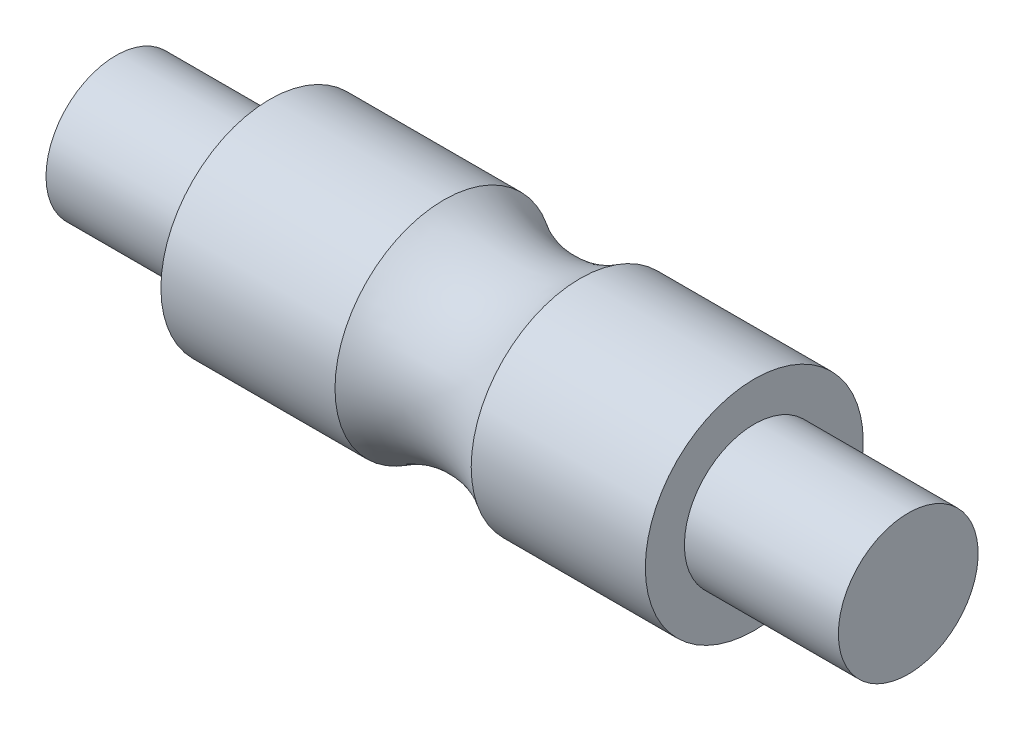
ISO-10303-21;
HEADER;
FILE_DESCRIPTION(('STEP AP214'),'2;1');
FILE_NAME('part.step','',(''),(''),'','','');
FILE_SCHEMA(('AUTOMOTIVE_DESIGN { 1 0 10303 214 1 1 1 1 }'));
ENDSEC;
DATA;
#1=APPLICATION_CONTEXT('core data for automotive mechanical design processes');
#2=APPLICATION_PROTOCOL_DEFINITION('international standard','automotive_design',2000,#1);
#3=PRODUCT_CONTEXT('',#1,'mechanical');
#4=PRODUCT('Part','Part','',(#3));
#5=PRODUCT_RELATED_PRODUCT_CATEGORY('part','',(#4));
#6=PRODUCT_DEFINITION_FORMATION('','',#4);
#7=PRODUCT_DEFINITION_CONTEXT('part definition',#1,'design');
#8=PRODUCT_DEFINITION('design','',#6,#7);
#9=PRODUCT_DEFINITION_SHAPE('','',#8);
#10=(LENGTH_UNIT() NAMED_UNIT(*) SI_UNIT(.MILLI.,.METRE.));
#11=(NAMED_UNIT(*) PLANE_ANGLE_UNIT() SI_UNIT($,.RADIAN.));
#12=(NAMED_UNIT(*) SI_UNIT($,.STERADIAN.) SOLID_ANGLE_UNIT());
#13=UNCERTAINTY_MEASURE_WITH_UNIT(LENGTH_MEASURE(1.E-05),#10,'distance_accuracy_value','');
#14=(GEOMETRIC_REPRESENTATION_CONTEXT(3) GLOBAL_UNCERTAINTY_ASSIGNED_CONTEXT((#13)) GLOBAL_UNIT_ASSIGNED_CONTEXT((#10,
#11,#12)) REPRESENTATION_CONTEXT('',''));
#15=CARTESIAN_POINT('',(0.,0.,0.));
#16=DIRECTION('',(0.,0.,1.));
#17=DIRECTION('',(1.,0.,0.));
#18=AXIS2_PLACEMENT_3D('',#15,#16,#17);
#19=CARTESIAN_POINT('',(0.,0.,0.));
#20=DIRECTION('',(-1.,0.,0.));
#21=DIRECTION('',(0.,0.,1.));
#22=AXIS2_PLACEMENT_3D('',#19,#20,#21);
#23=TOROIDAL_SURFACE('',#22,4.59086323529412,2.68586323529412);
#24=CARTESIAN_POINT('',(1.4605,0.,0.));
#25=DIRECTION('',(-1.,0.,0.));
#26=DIRECTION('',(0.,0.,1.));
#27=AXIS2_PLACEMENT_3D('',#24,#25,#26);
#28=CIRCLE('',#27,2.3368);
#29=CARTESIAN_POINT('',(1.4605,0.,2.3368));
#30=VERTEX_POINT('',#29);
#31=EDGE_CURVE('E10',#30,#30,#28,.T.);
#32=ORIENTED_EDGE('',*,*,#31,.T.);
#33=EDGE_LOOP('',(#32));
#34=FACE_BOUND('',#33,.T.);
#35=CARTESIAN_POINT('',(-1.4605,0.,0.));
#36=DIRECTION('',(-1.,0.,0.));
#37=DIRECTION('',(0.,0.,1.));
#38=AXIS2_PLACEMENT_3D('',#35,#36,#37);
#39=CIRCLE('',#38,2.3368);
#40=CARTESIAN_POINT('',(-1.4605,0.,2.3368));
#41=VERTEX_POINT('',#40);
#42=EDGE_CURVE('E63',#41,#41,#39,.T.);
#43=ORIENTED_EDGE('',*,*,#42,.F.);
#44=EDGE_LOOP('',(#43));
#45=FACE_BOUND('',#44,.T.);
#46=ADVANCED_FACE('F38',(#34,#45),#23,.F.);
#47=CARTESIAN_POINT('',(-9.90562938485226,0.,0.));
#48=DIRECTION('',(-1.,0.,0.));
#49=DIRECTION('',(0.,0.,1.));
#50=AXIS2_PLACEMENT_3D('',#47,#48,#49);
#51=CYLINDRICAL_SURFACE('',#50,2.3368);
#52=ORIENTED_EDGE('',*,*,#31,.F.);
#53=EDGE_LOOP('',(#52));
#54=FACE_BOUND('',#53,.T.);
#55=CARTESIAN_POINT('',(5.1943,0.,0.));
#56=DIRECTION('',(-1.,0.,0.));
#57=DIRECTION('',(0.,0.,1.));
#58=AXIS2_PLACEMENT_3D('',#55,#56,#57);
#59=CIRCLE('',#58,2.3368);
#60=CARTESIAN_POINT('',(5.1943,0.,2.3368));
#61=VERTEX_POINT('',#60);
#62=EDGE_CURVE('E45',#61,#61,#59,.T.);
#63=ORIENTED_EDGE('',*,*,#62,.T.);
#64=EDGE_LOOP('',(#63));
#65=FACE_BOUND('',#64,.T.);
#66=ADVANCED_FACE('F97',(#54,#65),#51,.T.);
#67=CARTESIAN_POINT('',(5.1943,1.4986,0.));
#68=DIRECTION('',(-1.,0.,0.));
#69=DIRECTION('',(0.,0.,1.));
#70=AXIS2_PLACEMENT_3D('',#67,#68,#69);
#71=PLANE('',#70);
#72=ORIENTED_EDGE('',*,*,#62,.F.);
#73=EDGE_LOOP('',(#72));
#74=FACE_BOUND('',#73,.T.);
#75=CARTESIAN_POINT('',(5.1943,0.,0.));
#76=DIRECTION('',(-1.,0.,0.));
#77=DIRECTION('',(0.,0.,1.));
#78=AXIS2_PLACEMENT_3D('',#75,#76,#77);
#79=CIRCLE('',#78,1.4986);
#80=CARTESIAN_POINT('',(5.1943,0.,1.4986));
#81=VERTEX_POINT('',#80);
#82=EDGE_CURVE('E51',#81,#81,#79,.T.);
#83=ORIENTED_EDGE('',*,*,#82,.T.);
#84=EDGE_LOOP('',(#83));
#85=FACE_BOUND('',#84,.T.);
#86=ADVANCED_FACE('F101',(#74,#85),#71,.F.);
#87=CARTESIAN_POINT('',(-9.90562938485226,0.,0.));
#88=DIRECTION('',(-1.,0.,0.));
#89=DIRECTION('',(0.,0.,1.));
#90=AXIS2_PLACEMENT_3D('',#87,#88,#89);
#91=CYLINDRICAL_SURFACE('',#90,1.4986);
#92=ORIENTED_EDGE('',*,*,#82,.F.);
#93=EDGE_LOOP('',(#92));
#94=FACE_BOUND('',#93,.T.);
#95=CARTESIAN_POINT('',(8.4963,0.,0.));
#96=DIRECTION('',(-1.,0.,0.));
#97=DIRECTION('',(0.,0.,1.));
#98=AXIS2_PLACEMENT_3D('',#95,#96,#97);
#99=CIRCLE('',#98,1.4986);
#100=CARTESIAN_POINT('',(8.4963,0.,1.4986));
#101=VERTEX_POINT('',#100);
#102=EDGE_CURVE('E57',#101,#101,#99,.T.);
#103=ORIENTED_EDGE('',*,*,#102,.T.);
#104=EDGE_LOOP('',(#103));
#105=FACE_BOUND('',#104,.T.);
#106=ADVANCED_FACE('F116',(#94,#105),#91,.T.);
#107=CARTESIAN_POINT('',(8.4963,0.,0.));
#108=DIRECTION('',(-1.,0.,0.));
#109=DIRECTION('',(0.,0.,1.));
#110=AXIS2_PLACEMENT_3D('',#107,#108,#109);
#111=PLANE('',#110);
#112=ORIENTED_EDGE('',*,*,#102,.F.);
#113=EDGE_LOOP('',(#112));
#114=FACE_BOUND('',#113,.T.);
#115=ADVANCED_FACE('F108',(#114),#111,.F.);
#116=CARTESIAN_POINT('',(9.90562938485226,0.,0.));
#117=DIRECTION('',(1.,0.,0.));
#118=DIRECTION('',(0.,0.,1.));
#119=AXIS2_PLACEMENT_3D('',#116,#117,#118);
#120=CYLINDRICAL_SURFACE('',#119,2.3368);
#121=ORIENTED_EDGE('',*,*,#42,.T.);
#122=EDGE_LOOP('',(#121));
#123=FACE_BOUND('',#122,.T.);
#124=CARTESIAN_POINT('',(-5.1943,0.,0.));
#125=DIRECTION('',(-1.,0.,0.));
#126=DIRECTION('',(0.,0.,1.));
#127=AXIS2_PLACEMENT_3D('',#124,#125,#126);
#128=CIRCLE('',#127,2.3368);
#129=CARTESIAN_POINT('',(-5.1943,0.,2.3368));
#130=VERTEX_POINT('',#129);
#131=EDGE_CURVE('E67',#130,#130,#128,.T.);
#132=ORIENTED_EDGE('',*,*,#131,.F.);
#133=EDGE_LOOP('',(#132));
#134=FACE_BOUND('',#133,.T.);
#135=ADVANCED_FACE('F93',(#123,#134),#120,.T.);
#136=CARTESIAN_POINT('',(-5.1943,1.4986,0.));
#137=DIRECTION('',(1.,0.,0.));
#138=DIRECTION('',(0.,0.,1.));
#139=AXIS2_PLACEMENT_3D('',#136,#137,#138);
#140=PLANE('',#139);
#141=ORIENTED_EDGE('',*,*,#131,.T.);
#142=EDGE_LOOP('',(#141));
#143=FACE_BOUND('',#142,.T.);
#144=CARTESIAN_POINT('',(-5.1943,0.,0.));
#145=DIRECTION('',(-1.,0.,0.));
#146=DIRECTION('',(0.,0.,1.));
#147=AXIS2_PLACEMENT_3D('',#144,#145,#146);
#148=CIRCLE('',#147,1.4986);
#149=CARTESIAN_POINT('',(-5.1943,0.,1.4986));
#150=VERTEX_POINT('',#149);
#151=EDGE_CURVE('E71',#150,#150,#148,.T.);
#152=ORIENTED_EDGE('',*,*,#151,.F.);
#153=EDGE_LOOP('',(#152));
#154=FACE_BOUND('',#153,.T.);
#155=ADVANCED_FACE('F85',(#143,#154),#140,.F.);
#156=CARTESIAN_POINT('',(9.90562938485226,0.,0.));
#157=DIRECTION('',(1.,0.,0.));
#158=DIRECTION('',(0.,0.,1.));
#159=AXIS2_PLACEMENT_3D('',#156,#157,#158);
#160=CYLINDRICAL_SURFACE('',#159,1.4986);
#161=ORIENTED_EDGE('',*,*,#151,.T.);
#162=EDGE_LOOP('',(#161));
#163=FACE_BOUND('',#162,.T.);
#164=CARTESIAN_POINT('',(-8.4963,0.,0.));
#165=DIRECTION('',(-1.,0.,0.));
#166=DIRECTION('',(0.,0.,1.));
#167=AXIS2_PLACEMENT_3D('',#164,#165,#166);
#168=CIRCLE('',#167,1.4986);
#169=CARTESIAN_POINT('',(-8.4963,0.,1.4986));
#170=VERTEX_POINT('',#169);
#171=EDGE_CURVE('E75',#170,#170,#168,.T.);
#172=ORIENTED_EDGE('',*,*,#171,.F.);
#173=EDGE_LOOP('',(#172));
#174=FACE_BOUND('',#173,.T.);
#175=ADVANCED_FACE('F83',(#163,#174),#160,.T.);
#176=CARTESIAN_POINT('',(-8.4963,0.,0.));
#177=DIRECTION('',(1.,0.,0.));
#178=DIRECTION('',(0.,0.,1.));
#179=AXIS2_PLACEMENT_3D('',#176,#177,#178);
#180=PLANE('',#179);
#181=ORIENTED_EDGE('',*,*,#171,.T.);
#182=EDGE_LOOP('',(#181));
#183=FACE_BOUND('',#182,.T.);
#184=ADVANCED_FACE('F81',(#183),#180,.F.);
#185=CLOSED_SHELL('',(#46,#66,#86,#106,#115,#135,#155,#175,#184));
#186=MANIFOLD_SOLID_BREP('B2',#185);
#187=ADVANCED_BREP_SHAPE_REPRESENTATION('',(#18,#186),#14);
#188=SHAPE_DEFINITION_REPRESENTATION(#9,#187);
ENDSEC;
END-ISO-10303-21;
